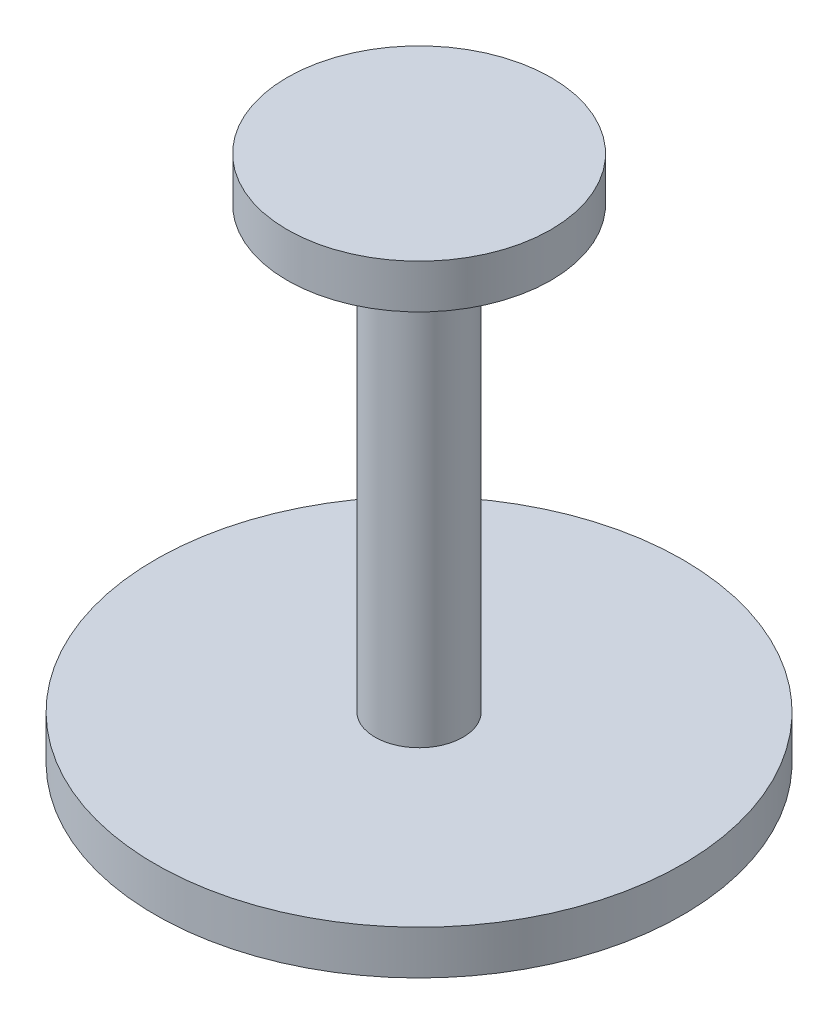
ISO-10303-21;
HEADER;
FILE_DESCRIPTION(('STEP AP214'),'2;1');
FILE_NAME('part.step','',(''),(''),'','','');
FILE_SCHEMA(('AUTOMOTIVE_DESIGN { 1 0 10303 214 1 1 1 1 }'));
ENDSEC;
DATA;
#1=APPLICATION_CONTEXT('core data for automotive mechanical design processes');
#2=APPLICATION_PROTOCOL_DEFINITION('international standard','automotive_design',2000,#1);
#3=PRODUCT_CONTEXT('',#1,'mechanical');
#4=PRODUCT('Part','Part','',(#3));
#5=PRODUCT_RELATED_PRODUCT_CATEGORY('part','',(#4));
#6=PRODUCT_DEFINITION_FORMATION('','',#4);
#7=PRODUCT_DEFINITION_CONTEXT('part definition',#1,'design');
#8=PRODUCT_DEFINITION('design','',#6,#7);
#9=PRODUCT_DEFINITION_SHAPE('','',#8);
#10=(LENGTH_UNIT() NAMED_UNIT(*) SI_UNIT(.MILLI.,.METRE.));
#11=(NAMED_UNIT(*) PLANE_ANGLE_UNIT() SI_UNIT($,.RADIAN.));
#12=(NAMED_UNIT(*) SI_UNIT($,.STERADIAN.) SOLID_ANGLE_UNIT());
#13=UNCERTAINTY_MEASURE_WITH_UNIT(LENGTH_MEASURE(1.E-05),#10,'distance_accuracy_value','');
#14=(GEOMETRIC_REPRESENTATION_CONTEXT(3) GLOBAL_UNCERTAINTY_ASSIGNED_CONTEXT((#13)) GLOBAL_UNIT_ASSIGNED_CONTEXT((#10,
#11,#12)) REPRESENTATION_CONTEXT('',''));
#15=CARTESIAN_POINT('',(0.,0.,0.));
#16=DIRECTION('',(0.,0.,1.));
#17=DIRECTION('',(1.,0.,0.));
#18=AXIS2_PLACEMENT_3D('',#15,#16,#17);
#19=CARTESIAN_POINT('',(38.1,0.,0.));
#20=DIRECTION('',(0.,-1.,0.));
#21=DIRECTION('',(0.,0.,-1.));
#22=AXIS2_PLACEMENT_3D('',#19,#20,#21);
#23=PLANE('',#22);
#24=CARTESIAN_POINT('',(0.,0.,0.));
#25=DIRECTION('',(0.,-1.,0.));
#26=DIRECTION('',(0.,0.,-1.));
#27=AXIS2_PLACEMENT_3D('',#24,#25,#26);
#28=CIRCLE('',#27,38.1);
#29=CARTESIAN_POINT('',(0.,0.,-38.1));
#30=VERTEX_POINT('',#29);
#31=EDGE_CURVE('E53',#30,#30,#28,.T.);
#32=ORIENTED_EDGE('',*,*,#31,.T.);
#33=EDGE_LOOP('',(#32));
#34=FACE_BOUND('',#33,.T.);
#35=ADVANCED_FACE('F31',(#34),#23,.T.);
#36=CARTESIAN_POINT('',(0.,76.2,0.));
#37=DIRECTION('',(0.,1.,0.));
#38=DIRECTION('',(0.,0.,1.));
#39=AXIS2_PLACEMENT_3D('',#36,#37,#38);
#40=PLANE('',#39);
#41=CARTESIAN_POINT('',(0.,76.2,0.));
#42=DIRECTION('',(0.,-1.,0.));
#43=DIRECTION('',(0.,0.,-1.));
#44=AXIS2_PLACEMENT_3D('',#41,#42,#43);
#45=CIRCLE('',#44,19.05);
#46=CARTESIAN_POINT('',(0.,76.2,-19.05));
#47=VERTEX_POINT('',#46);
#48=EDGE_CURVE('E10',#47,#47,#45,.T.);
#49=ORIENTED_EDGE('',*,*,#48,.F.);
#50=EDGE_LOOP('',(#49));
#51=FACE_BOUND('',#50,.T.);
#52=ADVANCED_FACE('F70',(#51),#40,.T.);
#53=CARTESIAN_POINT('',(0.,0.,0.));
#54=DIRECTION('',(0.,-1.,0.));
#55=DIRECTION('',(0.,0.,-1.));
#56=AXIS2_PLACEMENT_3D('',#53,#54,#55);
#57=CYLINDRICAL_SURFACE('',#56,19.05);
#58=ORIENTED_EDGE('',*,*,#48,.T.);
#59=EDGE_LOOP('',(#58));
#60=FACE_BOUND('',#59,.T.);
#61=CARTESIAN_POINT('',(0.,69.85,0.));
#62=DIRECTION('',(0.,-1.,0.));
#63=DIRECTION('',(0.,0.,-1.));
#64=AXIS2_PLACEMENT_3D('',#61,#62,#63);
#65=CIRCLE('',#64,19.05);
#66=CARTESIAN_POINT('',(0.,69.85,-19.05));
#67=VERTEX_POINT('',#66);
#68=EDGE_CURVE('E37',#67,#67,#65,.T.);
#69=ORIENTED_EDGE('',*,*,#68,.F.);
#70=EDGE_LOOP('',(#69));
#71=FACE_BOUND('',#70,.T.);
#72=ADVANCED_FACE('F74',(#60,#71),#57,.T.);
#73=CARTESIAN_POINT('',(19.05,69.85,0.));
#74=DIRECTION('',(0.,-1.,0.));
#75=DIRECTION('',(0.,0.,-1.));
#76=AXIS2_PLACEMENT_3D('',#73,#74,#75);
#77=PLANE('',#76);
#78=ORIENTED_EDGE('',*,*,#68,.T.);
#79=EDGE_LOOP('',(#78));
#80=FACE_BOUND('',#79,.T.);
#81=CARTESIAN_POINT('',(0.,69.85,0.));
#82=DIRECTION('',(0.,-1.,0.));
#83=DIRECTION('',(0.,0.,-1.));
#84=AXIS2_PLACEMENT_3D('',#81,#82,#83);
#85=CIRCLE('',#84,6.35);
#86=CARTESIAN_POINT('',(0.,69.85,-6.35));
#87=VERTEX_POINT('',#86);
#88=EDGE_CURVE('E41',#87,#87,#85,.T.);
#89=ORIENTED_EDGE('',*,*,#88,.F.);
#90=EDGE_LOOP('',(#89));
#91=FACE_BOUND('',#90,.T.);
#92=ADVANCED_FACE('F79',(#80,#91),#77,.T.);
#93=CARTESIAN_POINT('',(0.,0.,0.));
#94=DIRECTION('',(0.,-1.,0.));
#95=DIRECTION('',(0.,0.,-1.));
#96=AXIS2_PLACEMENT_3D('',#93,#94,#95);
#97=CYLINDRICAL_SURFACE('',#96,6.35);
#98=ORIENTED_EDGE('',*,*,#88,.T.);
#99=EDGE_LOOP('',(#98));
#100=FACE_BOUND('',#99,.T.);
#101=CARTESIAN_POINT('',(0.,6.35,0.));
#102=DIRECTION('',(0.,-1.,0.));
#103=DIRECTION('',(0.,0.,-1.));
#104=AXIS2_PLACEMENT_3D('',#101,#102,#103);
#105=CIRCLE('',#104,6.35000000000001);
#106=CARTESIAN_POINT('',(0.,6.35,-6.35000000000001));
#107=VERTEX_POINT('',#106);
#108=EDGE_CURVE('E45',#107,#107,#105,.T.);
#109=ORIENTED_EDGE('',*,*,#108,.F.);
#110=EDGE_LOOP('',(#109));
#111=FACE_BOUND('',#110,.T.);
#112=ADVANCED_FACE('F66',(#100,#111),#97,.T.);
#113=CARTESIAN_POINT('',(6.35000000000001,6.35,0.));
#114=DIRECTION('',(0.,1.,0.));
#115=DIRECTION('',(0.,0.,1.));
#116=AXIS2_PLACEMENT_3D('',#113,#114,#115);
#117=PLANE('',#116);
#118=ORIENTED_EDGE('',*,*,#108,.T.);
#119=EDGE_LOOP('',(#118));
#120=FACE_BOUND('',#119,.T.);
#121=CARTESIAN_POINT('',(0.,6.35,0.));
#122=DIRECTION('',(0.,-1.,0.));
#123=DIRECTION('',(0.,0.,-1.));
#124=AXIS2_PLACEMENT_3D('',#121,#122,#123);
#125=CIRCLE('',#124,38.1);
#126=CARTESIAN_POINT('',(0.,6.35,-38.1));
#127=VERTEX_POINT('',#126);
#128=EDGE_CURVE('E50',#127,#127,#125,.T.);
#129=ORIENTED_EDGE('',*,*,#128,.F.);
#130=EDGE_LOOP('',(#129));
#131=FACE_BOUND('',#130,.T.);
#132=ADVANCED_FACE('F60',(#120,#131),#117,.T.);
#133=CARTESIAN_POINT('',(0.,0.,0.));
#134=DIRECTION('',(0.,-1.,0.));
#135=DIRECTION('',(0.,0.,-1.));
#136=AXIS2_PLACEMENT_3D('',#133,#134,#135);
#137=CYLINDRICAL_SURFACE('',#136,38.1);
#138=ORIENTED_EDGE('',*,*,#128,.T.);
#139=EDGE_LOOP('',(#138));
#140=FACE_BOUND('',#139,.T.);
#141=ORIENTED_EDGE('',*,*,#31,.F.);
#142=EDGE_LOOP('',(#141));
#143=FACE_BOUND('',#142,.T.);
#144=ADVANCED_FACE('F58',(#140,#143),#137,.T.);
#145=CLOSED_SHELL('',(#35,#52,#72,#92,#112,#132,#144));
#146=MANIFOLD_SOLID_BREP('B2',#145);
#147=ADVANCED_BREP_SHAPE_REPRESENTATION('',(#18,#146),#14);
#148=SHAPE_DEFINITION_REPRESENTATION(#9,#147);
ENDSEC;
END-ISO-10303-21;
